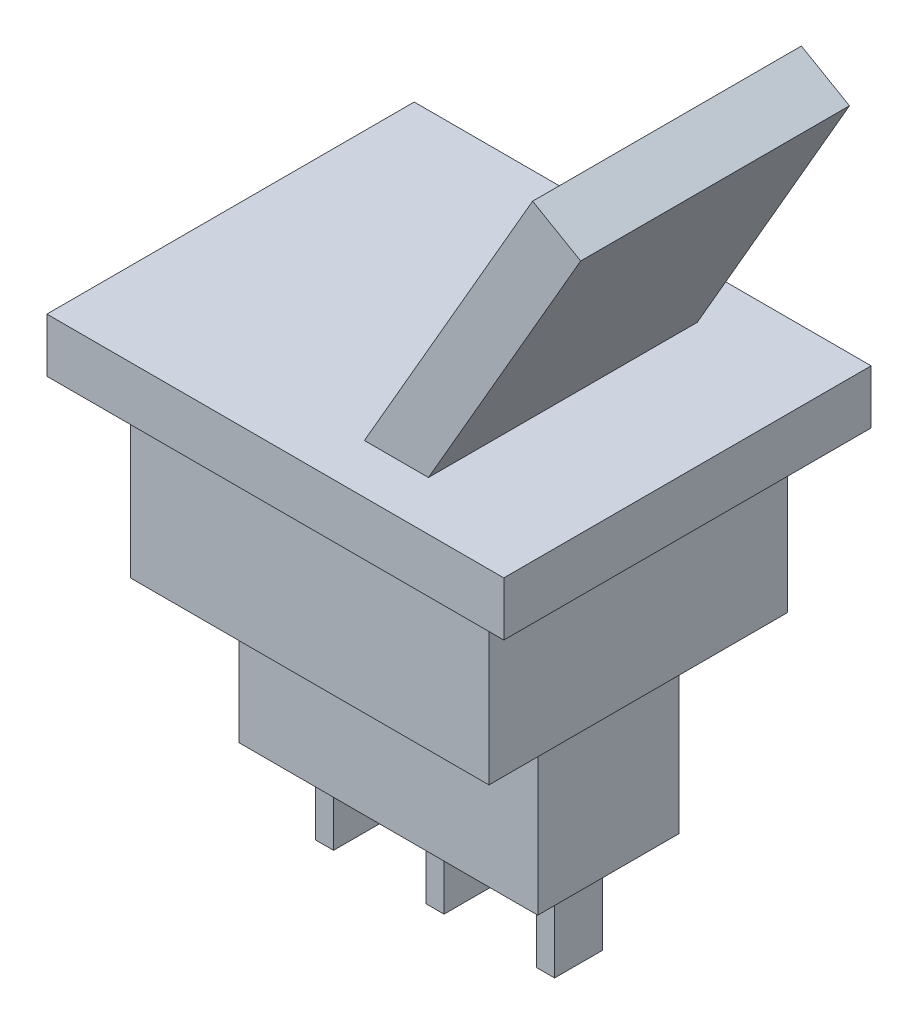
ISO-10303-21;
HEADER;
FILE_DESCRIPTION(('STEP AP214'),'2;1');
FILE_NAME('part.step','',(''),(''),'','','');
FILE_SCHEMA(('AUTOMOTIVE_DESIGN { 1 0 10303 214 1 1 1 1 }'));
ENDSEC;
DATA;
#1=APPLICATION_CONTEXT('core data for automotive mechanical design processes');
#2=APPLICATION_PROTOCOL_DEFINITION('international standard','automotive_design',2000,#1);
#3=PRODUCT_CONTEXT('',#1,'mechanical');
#4=PRODUCT('Part','Part','',(#3));
#5=PRODUCT_RELATED_PRODUCT_CATEGORY('part','',(#4));
#6=PRODUCT_DEFINITION_FORMATION('','',#4);
#7=PRODUCT_DEFINITION_CONTEXT('part definition',#1,'design');
#8=PRODUCT_DEFINITION('design','',#6,#7);
#9=PRODUCT_DEFINITION_SHAPE('','',#8);
#10=(LENGTH_UNIT() NAMED_UNIT(*) SI_UNIT(.MILLI.,.METRE.));
#11=(NAMED_UNIT(*) PLANE_ANGLE_UNIT() SI_UNIT($,.RADIAN.));
#12=(NAMED_UNIT(*) SI_UNIT($,.STERADIAN.) SOLID_ANGLE_UNIT());
#13=UNCERTAINTY_MEASURE_WITH_UNIT(LENGTH_MEASURE(1.E-05),#10,'distance_accuracy_value','');
#14=(GEOMETRIC_REPRESENTATION_CONTEXT(3) GLOBAL_UNCERTAINTY_ASSIGNED_CONTEXT((#13)) GLOBAL_UNIT_ASSIGNED_CONTEXT((#10,
#11,#12)) REPRESENTATION_CONTEXT('',''));
#15=CARTESIAN_POINT('',(0.,0.,0.));
#16=DIRECTION('',(0.,0.,1.));
#17=DIRECTION('',(1.,0.,0.));
#18=AXIS2_PLACEMENT_3D('',#15,#16,#17);
#19=CARTESIAN_POINT('',(0.,-14.22,0.));
#20=DIRECTION('',(0.,-1.,0.));
#21=DIRECTION('',(0.,0.,-1.));
#22=AXIS2_PLACEMENT_3D('',#19,#20,#21);
#23=PLANE('',#22);
#24=DIRECTION('',(0.,0.,1.));
#25=VECTOR('',#24,1.);
#26=CARTESIAN_POINT('',(6.35,-14.22,3.));
#27=LINE('',#26,#25);
#28=CARTESIAN_POINT('',(6.35,-14.22,-3.));
#29=VERTEX_POINT('',#28);
#30=CARTESIAN_POINT('',(6.35,-14.22,3.));
#31=VERTEX_POINT('',#30);
#32=EDGE_CURVE('E334',#29,#31,#27,.T.);
#33=ORIENTED_EDGE('',*,*,#32,.T.);
#34=DIRECTION('',(-1.,0.,0.));
#35=VECTOR('',#34,1.);
#36=CARTESIAN_POINT('',(-6.35,-14.22,3.));
#37=LINE('',#36,#35);
#38=CARTESIAN_POINT('',(-6.35,-14.22,3.));
#39=VERTEX_POINT('',#38);
#40=EDGE_CURVE('E337',#31,#39,#37,.T.);
#41=ORIENTED_EDGE('',*,*,#40,.T.);
#42=DIRECTION('',(0.,0.,-1.));
#43=VECTOR('',#42,1.);
#44=CARTESIAN_POINT('',(-6.35,-14.22,3.));
#45=LINE('',#44,#43);
#46=CARTESIAN_POINT('',(-6.35,-14.22,-3.));
#47=VERTEX_POINT('',#46);
#48=EDGE_CURVE('E340',#39,#47,#45,.T.);
#49=ORIENTED_EDGE('',*,*,#48,.T.);
#50=DIRECTION('',(1.,0.,0.));
#51=VECTOR('',#50,1.);
#52=CARTESIAN_POINT('',(-6.35,-14.22,-3.));
#53=LINE('',#52,#51);
#54=EDGE_CURVE('E342',#47,#29,#53,.T.);
#55=ORIENTED_EDGE('',*,*,#54,.T.);
#56=EDGE_LOOP('',(#33,#41,#49,#55));
#57=FACE_BOUND('',#56,.T.);
#58=DIRECTION('',(-1.,0.,0.));
#59=VECTOR('',#58,1.);
#60=CARTESIAN_POINT('',(-5.08,-14.22,1.015));
#61=LINE('',#60,#59);
#62=CARTESIAN_POINT('',(-4.32,-14.22,1.015));
#63=VERTEX_POINT('',#62);
#64=CARTESIAN_POINT('',(-5.08,-14.22,1.015));
#65=VERTEX_POINT('',#64);
#66=EDGE_CURVE('E318',#63,#65,#61,.T.);
#67=ORIENTED_EDGE('',*,*,#66,.F.);
#68=DIRECTION('',(0.,0.,1.));
#69=VECTOR('',#68,1.);
#70=CARTESIAN_POINT('',(-4.32,-14.22,1.015));
#71=LINE('',#70,#69);
#72=CARTESIAN_POINT('',(-4.32,-14.22,-1.015));
#73=VERTEX_POINT('',#72);
#74=EDGE_CURVE('E304',#73,#63,#71,.T.);
#75=ORIENTED_EDGE('',*,*,#74,.F.);
#76=DIRECTION('',(1.,0.,0.));
#77=VECTOR('',#76,1.);
#78=CARTESIAN_POINT('',(-5.08,-14.22,-1.015));
#79=LINE('',#78,#77);
#80=CARTESIAN_POINT('',(-5.08,-14.22,-1.015));
#81=VERTEX_POINT('',#80);
#82=EDGE_CURVE('E309',#81,#73,#79,.T.);
#83=ORIENTED_EDGE('',*,*,#82,.F.);
#84=DIRECTION('',(0.,0.,-1.));
#85=VECTOR('',#84,1.);
#86=CARTESIAN_POINT('',(-5.08,-14.22,1.015));
#87=LINE('',#86,#85);
#88=EDGE_CURVE('E320',#65,#81,#87,.T.);
#89=ORIENTED_EDGE('',*,*,#88,.F.);
#90=EDGE_LOOP('',(#67,#75,#83,#89));
#91=FACE_BOUND('',#90,.T.);
#92=DIRECTION('',(0.,0.,1.));
#93=VECTOR('',#92,1.);
#94=CARTESIAN_POINT('',(0.38,-14.22,1.015));
#95=LINE('',#94,#93);
#96=CARTESIAN_POINT('',(0.38,-14.22,-1.015));
#97=VERTEX_POINT('',#96);
#98=CARTESIAN_POINT('',(0.38,-14.22,1.015));
#99=VERTEX_POINT('',#98);
#100=EDGE_CURVE('E289',#97,#99,#95,.T.);
#101=ORIENTED_EDGE('',*,*,#100,.F.);
#102=DIRECTION('',(1.,0.,0.));
#103=VECTOR('',#102,1.);
#104=CARTESIAN_POINT('',(-0.38,-14.22,-1.015));
#105=LINE('',#104,#103);
#106=CARTESIAN_POINT('',(-0.38,-14.22,-1.015));
#107=VERTEX_POINT('',#106);
#108=EDGE_CURVE('E275',#107,#97,#105,.T.);
#109=ORIENTED_EDGE('',*,*,#108,.F.);
#110=DIRECTION('',(0.,0.,-1.));
#111=VECTOR('',#110,1.);
#112=CARTESIAN_POINT('',(-0.38,-14.22,1.015));
#113=LINE('',#112,#111);
#114=CARTESIAN_POINT('',(-0.38,-14.22,1.015));
#115=VERTEX_POINT('',#114);
#116=EDGE_CURVE('E280',#115,#107,#113,.T.);
#117=ORIENTED_EDGE('',*,*,#116,.F.);
#118=DIRECTION('',(-1.,0.,0.));
#119=VECTOR('',#118,1.);
#120=CARTESIAN_POINT('',(-0.38,-14.22,1.015));
#121=LINE('',#120,#119);
#122=EDGE_CURVE('E291',#99,#115,#121,.T.);
#123=ORIENTED_EDGE('',*,*,#122,.F.);
#124=EDGE_LOOP('',(#101,#109,#117,#123));
#125=FACE_BOUND('',#124,.T.);
#126=DIRECTION('',(0.,0.,1.));
#127=VECTOR('',#126,1.);
#128=CARTESIAN_POINT('',(5.08,-14.22,1.015));
#129=LINE('',#128,#127);
#130=CARTESIAN_POINT('',(5.08,-14.22,-1.015));
#131=VERTEX_POINT('',#130);
#132=CARTESIAN_POINT('',(5.08,-14.22,1.015));
#133=VERTEX_POINT('',#132);
#134=EDGE_CURVE('E260',#131,#133,#129,.T.);
#135=ORIENTED_EDGE('',*,*,#134,.F.);
#136=DIRECTION('',(1.,0.,0.));
#137=VECTOR('',#136,1.);
#138=CARTESIAN_POINT('',(4.32,-14.22,-1.015));
#139=LINE('',#138,#137);
#140=CARTESIAN_POINT('',(4.32,-14.22,-1.015));
#141=VERTEX_POINT('',#140);
#142=EDGE_CURVE('E245',#141,#131,#139,.T.);
#143=ORIENTED_EDGE('',*,*,#142,.F.);
#144=DIRECTION('',(0.,0.,-1.));
#145=VECTOR('',#144,1.);
#146=CARTESIAN_POINT('',(4.32,-14.22,1.015));
#147=LINE('',#146,#145);
#148=CARTESIAN_POINT('',(4.32,-14.22,1.015));
#149=VERTEX_POINT('',#148);
#150=EDGE_CURVE('E251',#149,#141,#147,.T.);
#151=ORIENTED_EDGE('',*,*,#150,.F.);
#152=DIRECTION('',(-1.,0.,0.));
#153=VECTOR('',#152,1.);
#154=CARTESIAN_POINT('',(4.32,-14.22,1.015));
#155=LINE('',#154,#153);
#156=EDGE_CURVE('E262',#133,#149,#155,.T.);
#157=ORIENTED_EDGE('',*,*,#156,.F.);
#158=EDGE_LOOP('',(#135,#143,#151,#157));
#159=FACE_BOUND('',#158,.T.);
#160=ADVANCED_FACE('F33',(#57,#91,#125,#159),#23,.T.);
#161=CARTESIAN_POINT('',(0.,-7.11,0.));
#162=DIRECTION('',(0.,1.,0.));
#163=DIRECTION('',(0.,0.,1.));
#164=AXIS2_PLACEMENT_3D('',#161,#162,#163);
#165=PLANE('',#164);
#166=DIRECTION('',(0.,0.,1.));
#167=VECTOR('',#166,1.);
#168=CARTESIAN_POINT('',(7.625,-7.11,-6.35));
#169=LINE('',#168,#167);
#170=CARTESIAN_POINT('',(7.625,-7.11,-6.35));
#171=VERTEX_POINT('',#170);
#172=CARTESIAN_POINT('',(7.625,-7.11,6.35));
#173=VERTEX_POINT('',#172);
#174=EDGE_CURVE('E367',#171,#173,#169,.T.);
#175=ORIENTED_EDGE('',*,*,#174,.T.);
#176=DIRECTION('',(-1.,0.,0.));
#177=VECTOR('',#176,1.);
#178=CARTESIAN_POINT('',(-7.625,-7.11,6.35));
#179=LINE('',#178,#177);
#180=CARTESIAN_POINT('',(-7.625,-7.11,6.35));
#181=VERTEX_POINT('',#180);
#182=EDGE_CURVE('E370',#173,#181,#179,.T.);
#183=ORIENTED_EDGE('',*,*,#182,.T.);
#184=DIRECTION('',(0.,0.,-1.));
#185=VECTOR('',#184,1.);
#186=CARTESIAN_POINT('',(-7.625,-7.11,-6.35));
#187=LINE('',#186,#185);
#188=CARTESIAN_POINT('',(-7.625,-7.11,-6.35));
#189=VERTEX_POINT('',#188);
#190=EDGE_CURVE('E373',#181,#189,#187,.T.);
#191=ORIENTED_EDGE('',*,*,#190,.T.);
#192=DIRECTION('',(1.,0.,0.));
#193=VECTOR('',#192,1.);
#194=CARTESIAN_POINT('',(-7.625,-7.11,-6.35));
#195=LINE('',#194,#193);
#196=EDGE_CURVE('E375',#189,#171,#195,.T.);
#197=ORIENTED_EDGE('',*,*,#196,.T.);
#198=EDGE_LOOP('',(#175,#183,#191,#197));
#199=FACE_BOUND('',#198,.T.);
#200=DIRECTION('',(0.,0.,1.));
#201=VECTOR('',#200,1.);
#202=CARTESIAN_POINT('',(6.35,-7.11,3.));
#203=LINE('',#202,#201);
#204=CARTESIAN_POINT('',(6.35,-7.11,-3.));
#205=VERTEX_POINT('',#204);
#206=CARTESIAN_POINT('',(6.35,-7.11,3.));
#207=VERTEX_POINT('',#206);
#208=EDGE_CURVE('E333',#205,#207,#203,.T.);
#209=ORIENTED_EDGE('',*,*,#208,.F.);
#210=DIRECTION('',(1.,0.,0.));
#211=VECTOR('',#210,1.);
#212=CARTESIAN_POINT('',(-6.35,-7.11,-3.));
#213=LINE('',#212,#211);
#214=CARTESIAN_POINT('',(-6.35,-7.11,-3.));
#215=VERTEX_POINT('',#214);
#216=EDGE_CURVE('E338',#215,#205,#213,.T.);
#217=ORIENTED_EDGE('',*,*,#216,.F.);
#218=DIRECTION('',(0.,0.,-1.));
#219=VECTOR('',#218,1.);
#220=CARTESIAN_POINT('',(-6.35,-7.11,3.));
#221=LINE('',#220,#219);
#222=CARTESIAN_POINT('',(-6.35,-7.11,3.));
#223=VERTEX_POINT('',#222);
#224=EDGE_CURVE('E350',#223,#215,#221,.T.);
#225=ORIENTED_EDGE('',*,*,#224,.F.);
#226=DIRECTION('',(-1.,0.,0.));
#227=VECTOR('',#226,1.);
#228=CARTESIAN_POINT('',(-6.35,-7.11,3.));
#229=LINE('',#228,#227);
#230=EDGE_CURVE('E347',#207,#223,#229,.T.);
#231=ORIENTED_EDGE('',*,*,#230,.F.);
#232=EDGE_LOOP('',(#209,#217,#225,#231));
#233=FACE_BOUND('',#232,.T.);
#234=ADVANCED_FACE('F450',(#199,#233),#165,.F.);
#235=CARTESIAN_POINT('',(9.715,2.29,7.81));
#236=DIRECTION('',(-1.,0.,0.));
#237=DIRECTION('',(0.,0.,1.));
#238=AXIS2_PLACEMENT_3D('',#235,#236,#237);
#239=PLANE('',#238);
#240=DIRECTION('',(0.,0.,-1.));
#241=VECTOR('',#240,1.);
#242=CARTESIAN_POINT('',(9.715,0.,7.81));
#243=LINE('',#242,#241);
#244=CARTESIAN_POINT('',(9.715,0.,7.81));
#245=VERTEX_POINT('',#244);
#246=CARTESIAN_POINT('',(9.715,0.,-7.81));
#247=VERTEX_POINT('',#246);
#248=EDGE_CURVE('E399',#245,#247,#243,.T.);
#249=ORIENTED_EDGE('',*,*,#248,.T.);
#250=DIRECTION('',(0.,-1.,0.));
#251=VECTOR('',#250,1.);
#252=CARTESIAN_POINT('',(9.715,2.29,-7.81));
#253=LINE('',#252,#251);
#254=CARTESIAN_POINT('',(9.715,2.29,-7.81));
#255=VERTEX_POINT('',#254);
#256=EDGE_CURVE('E426',#255,#247,#253,.T.);
#257=ORIENTED_EDGE('',*,*,#256,.F.);
#258=DIRECTION('',(0.,0.,-1.));
#259=VECTOR('',#258,1.);
#260=CARTESIAN_POINT('',(9.715,2.29,7.81));
#261=LINE('',#260,#259);
#262=CARTESIAN_POINT('',(9.715,2.29,7.81));
#263=VERTEX_POINT('',#262);
#264=EDGE_CURVE('E400',#263,#255,#261,.T.);
#265=ORIENTED_EDGE('',*,*,#264,.F.);
#266=DIRECTION('',(0.,-1.,0.));
#267=VECTOR('',#266,1.);
#268=CARTESIAN_POINT('',(9.715,2.29,7.81));
#269=LINE('',#268,#267);
#270=EDGE_CURVE('E410',#263,#245,#269,.T.);
#271=ORIENTED_EDGE('',*,*,#270,.T.);
#272=EDGE_LOOP('',(#249,#257,#265,#271));
#273=FACE_BOUND('',#272,.T.);
#274=ADVANCED_FACE('F35',(#273),#239,.F.);
#275=CARTESIAN_POINT('',(-9.715,2.29,-7.81));
#276=DIRECTION('',(0.,0.,1.));
#277=DIRECTION('',(1.,0.,0.));
#278=AXIS2_PLACEMENT_3D('',#275,#276,#277);
#279=PLANE('',#278);
#280=DIRECTION('',(-1.,0.,0.));
#281=VECTOR('',#280,1.);
#282=CARTESIAN_POINT('',(-9.715,0.,-7.81));
#283=LINE('',#282,#281);
#284=CARTESIAN_POINT('',(-9.715,0.,-7.81));
#285=VERTEX_POINT('',#284);
#286=EDGE_CURVE('E413',#247,#285,#283,.T.);
#287=ORIENTED_EDGE('',*,*,#286,.T.);
#288=DIRECTION('',(0.,-1.,0.));
#289=VECTOR('',#288,1.);
#290=CARTESIAN_POINT('',(-9.715,2.29,-7.81));
#291=LINE('',#290,#289);
#292=CARTESIAN_POINT('',(-9.715,2.29,-7.81));
#293=VERTEX_POINT('',#292);
#294=EDGE_CURVE('E423',#293,#285,#291,.T.);
#295=ORIENTED_EDGE('',*,*,#294,.F.);
#296=DIRECTION('',(-1.,0.,0.));
#297=VECTOR('',#296,1.);
#298=CARTESIAN_POINT('',(-9.715,2.29,-7.81));
#299=LINE('',#298,#297);
#300=EDGE_CURVE('E403',#255,#293,#299,.T.);
#301=ORIENTED_EDGE('',*,*,#300,.F.);
#302=ORIENTED_EDGE('',*,*,#256,.T.);
#303=EDGE_LOOP('',(#287,#295,#301,#302));
#304=FACE_BOUND('',#303,.T.);
#305=ADVANCED_FACE('F507',(#304),#279,.F.);
#306=CARTESIAN_POINT('',(-9.715,2.29,7.81));
#307=DIRECTION('',(1.,0.,0.));
#308=DIRECTION('',(0.,0.,-1.));
#309=AXIS2_PLACEMENT_3D('',#306,#307,#308);
#310=PLANE('',#309);
#311=DIRECTION('',(0.,0.,1.));
#312=VECTOR('',#311,1.);
#313=CARTESIAN_POINT('',(-9.715,0.,7.81));
#314=LINE('',#313,#312);
#315=CARTESIAN_POINT('',(-9.715,0.,7.81));
#316=VERTEX_POINT('',#315);
#317=EDGE_CURVE('E415',#285,#316,#314,.T.);
#318=ORIENTED_EDGE('',*,*,#317,.T.);
#319=DIRECTION('',(0.,-1.,0.));
#320=VECTOR('',#319,1.);
#321=CARTESIAN_POINT('',(-9.715,2.29,7.81));
#322=LINE('',#321,#320);
#323=CARTESIAN_POINT('',(-9.715,2.29,7.81));
#324=VERTEX_POINT('',#323);
#325=EDGE_CURVE('E420',#324,#316,#322,.T.);
#326=ORIENTED_EDGE('',*,*,#325,.F.);
#327=DIRECTION('',(0.,0.,1.));
#328=VECTOR('',#327,1.);
#329=CARTESIAN_POINT('',(-9.715,2.29,7.81));
#330=LINE('',#329,#328);
#331=EDGE_CURVE('E406',#293,#324,#330,.T.);
#332=ORIENTED_EDGE('',*,*,#331,.F.);
#333=ORIENTED_EDGE('',*,*,#294,.T.);
#334=EDGE_LOOP('',(#318,#326,#332,#333));
#335=FACE_BOUND('',#334,.T.);
#336=ADVANCED_FACE('F504',(#335),#310,.F.);
#337=CARTESIAN_POINT('',(-9.715,2.29,7.81));
#338=DIRECTION('',(0.,0.,-1.));
#339=DIRECTION('',(-1.,0.,0.));
#340=AXIS2_PLACEMENT_3D('',#337,#338,#339);
#341=PLANE('',#340);
#342=DIRECTION('',(1.,0.,0.));
#343=VECTOR('',#342,1.);
#344=CARTESIAN_POINT('',(-9.715,0.,7.81));
#345=LINE('',#344,#343);
#346=EDGE_CURVE('E404',#316,#245,#345,.T.);
#347=ORIENTED_EDGE('',*,*,#346,.T.);
#348=ORIENTED_EDGE('',*,*,#270,.F.);
#349=DIRECTION('',(1.,0.,0.));
#350=VECTOR('',#349,1.);
#351=CARTESIAN_POINT('',(-9.715,2.29,7.81));
#352=LINE('',#351,#350);
#353=EDGE_CURVE('E408',#324,#263,#352,.T.);
#354=ORIENTED_EDGE('',*,*,#353,.F.);
#355=ORIENTED_EDGE('',*,*,#325,.T.);
#356=EDGE_LOOP('',(#347,#348,#354,#355));
#357=FACE_BOUND('',#356,.T.);
#358=ADVANCED_FACE('F498',(#357),#341,.F.);
#359=CARTESIAN_POINT('',(0.,2.29,0.));
#360=DIRECTION('',(0.,-1.,0.));
#361=DIRECTION('',(0.,0.,-1.));
#362=AXIS2_PLACEMENT_3D('',#359,#360,#361);
#363=PLANE('',#362);
#364=DIRECTION('',(0.,0.,-1.));
#365=VECTOR('',#364,1.);
#366=CARTESIAN_POINT('',(1.69163628872558,2.29,0.));
#367=LINE('',#366,#365);
#368=CARTESIAN_POINT('',(1.69163628872558,2.29,5.715));
#369=VERTEX_POINT('',#368);
#370=CARTESIAN_POINT('',(1.69163628872558,2.29,-5.715));
#371=VERTEX_POINT('',#370);
#372=EDGE_CURVE('E41',#369,#371,#367,.T.);
#373=ORIENTED_EDGE('',*,*,#372,.T.);
#374=DIRECTION('',(1.,0.,0.));
#375=VECTOR('',#374,1.);
#376=CARTESIAN_POINT('',(0.,2.29,-5.715));
#377=LINE('',#376,#375);
#378=CARTESIAN_POINT('',(4.41672955930062,2.29,-5.715));
#379=VERTEX_POINT('',#378);
#380=EDGE_CURVE('E11',#371,#379,#377,.T.);
#381=ORIENTED_EDGE('',*,*,#380,.T.);
#382=DIRECTION('',(0.,0.,1.));
#383=VECTOR('',#382,1.);
#384=CARTESIAN_POINT('',(4.41672955930062,2.29,0.));
#385=LINE('',#384,#383);
#386=CARTESIAN_POINT('',(4.41672955930062,2.29,5.715));
#387=VERTEX_POINT('',#386);
#388=EDGE_CURVE('E430',#379,#387,#385,.T.);
#389=ORIENTED_EDGE('',*,*,#388,.T.);
#390=DIRECTION('',(1.,0.,0.));
#391=VECTOR('',#390,1.);
#392=CARTESIAN_POINT('',(0.,2.29,5.715));
#393=LINE('',#392,#391);
#394=EDGE_CURVE('E221',#369,#387,#393,.T.);
#395=ORIENTED_EDGE('',*,*,#394,.F.);
#396=EDGE_LOOP('',(#373,#381,#389,#395));
#397=FACE_BOUND('',#396,.T.);
#398=ORIENTED_EDGE('',*,*,#264,.T.);
#399=ORIENTED_EDGE('',*,*,#300,.T.);
#400=ORIENTED_EDGE('',*,*,#331,.T.);
#401=ORIENTED_EDGE('',*,*,#353,.T.);
#402=EDGE_LOOP('',(#398,#399,#400,#401));
#403=FACE_BOUND('',#402,.T.);
#404=ADVANCED_FACE('F431',(#397,#403),#363,.F.);
#405=CARTESIAN_POINT('',(0.,0.,0.));
#406=DIRECTION('',(0.,-1.,0.));
#407=DIRECTION('',(0.,0.,-1.));
#408=AXIS2_PLACEMENT_3D('',#405,#406,#407);
#409=PLANE('',#408);
#410=DIRECTION('',(0.,0.,1.));
#411=VECTOR('',#410,1.);
#412=CARTESIAN_POINT('',(7.625,0.,-6.35));
#413=LINE('',#412,#411);
#414=CARTESIAN_POINT('',(7.625,0.,-6.35));
#415=VERTEX_POINT('',#414);
#416=CARTESIAN_POINT('',(7.625,0.,6.35));
#417=VERTEX_POINT('',#416);
#418=EDGE_CURVE('E366',#415,#417,#413,.T.);
#419=ORIENTED_EDGE('',*,*,#418,.F.);
#420=DIRECTION('',(1.,0.,0.));
#421=VECTOR('',#420,1.);
#422=CARTESIAN_POINT('',(-7.625,0.,-6.35));
#423=LINE('',#422,#421);
#424=CARTESIAN_POINT('',(-7.625,0.,-6.35));
#425=VERTEX_POINT('',#424);
#426=EDGE_CURVE('E371',#425,#415,#423,.T.);
#427=ORIENTED_EDGE('',*,*,#426,.F.);
#428=DIRECTION('',(0.,0.,-1.));
#429=VECTOR('',#428,1.);
#430=CARTESIAN_POINT('',(-7.625,0.,-6.35));
#431=LINE('',#430,#429);
#432=CARTESIAN_POINT('',(-7.625,0.,6.35));
#433=VERTEX_POINT('',#432);
#434=EDGE_CURVE('E383',#433,#425,#431,.T.);
#435=ORIENTED_EDGE('',*,*,#434,.F.);
#436=DIRECTION('',(-1.,0.,0.));
#437=VECTOR('',#436,1.);
#438=CARTESIAN_POINT('',(-7.625,0.,6.35));
#439=LINE('',#438,#437);
#440=EDGE_CURVE('E380',#417,#433,#439,.T.);
#441=ORIENTED_EDGE('',*,*,#440,.F.);
#442=EDGE_LOOP('',(#419,#427,#435,#441));
#443=FACE_BOUND('',#442,.T.);
#444=ORIENTED_EDGE('',*,*,#248,.F.);
#445=ORIENTED_EDGE('',*,*,#346,.F.);
#446=ORIENTED_EDGE('',*,*,#317,.F.);
#447=ORIENTED_EDGE('',*,*,#286,.F.);
#448=EDGE_LOOP('',(#444,#445,#446,#447));
#449=FACE_BOUND('',#448,.T.);
#450=ADVANCED_FACE('F494',(#443,#449),#409,.T.);
#451=CARTESIAN_POINT('',(7.625,-7.11,-6.35));
#452=DIRECTION('',(-1.,0.,0.));
#453=DIRECTION('',(0.,0.,1.));
#454=AXIS2_PLACEMENT_3D('',#451,#452,#453);
#455=PLANE('',#454);
#456=ORIENTED_EDGE('',*,*,#418,.T.);
#457=DIRECTION('',(0.,1.,0.));
#458=VECTOR('',#457,1.);
#459=CARTESIAN_POINT('',(7.625,-7.11,6.35));
#460=LINE('',#459,#458);
#461=EDGE_CURVE('E396',#173,#417,#460,.T.);
#462=ORIENTED_EDGE('',*,*,#461,.F.);
#463=ORIENTED_EDGE('',*,*,#174,.F.);
#464=DIRECTION('',(0.,1.,0.));
#465=VECTOR('',#464,1.);
#466=CARTESIAN_POINT('',(7.625,-7.11,-6.35));
#467=LINE('',#466,#465);
#468=EDGE_CURVE('E377',#171,#415,#467,.T.);
#469=ORIENTED_EDGE('',*,*,#468,.T.);
#470=EDGE_LOOP('',(#456,#462,#463,#469));
#471=FACE_BOUND('',#470,.T.);
#472=ADVANCED_FACE('F490',(#471),#455,.F.);
#473=CARTESIAN_POINT('',(-7.625,-7.11,6.35));
#474=DIRECTION('',(0.,0.,-1.));
#475=DIRECTION('',(-1.,0.,0.));
#476=AXIS2_PLACEMENT_3D('',#473,#474,#475);
#477=PLANE('',#476);
#478=ORIENTED_EDGE('',*,*,#440,.T.);
#479=DIRECTION('',(0.,1.,0.));
#480=VECTOR('',#479,1.);
#481=CARTESIAN_POINT('',(-7.625,-7.11,6.35));
#482=LINE('',#481,#480);
#483=EDGE_CURVE('E393',#181,#433,#482,.T.);
#484=ORIENTED_EDGE('',*,*,#483,.F.);
#485=ORIENTED_EDGE('',*,*,#182,.F.);
#486=ORIENTED_EDGE('',*,*,#461,.T.);
#487=EDGE_LOOP('',(#478,#484,#485,#486));
#488=FACE_BOUND('',#487,.T.);
#489=ADVANCED_FACE('F486',(#488),#477,.F.);
#490=CARTESIAN_POINT('',(-7.625,-7.11,-6.35));
#491=DIRECTION('',(1.,0.,0.));
#492=DIRECTION('',(0.,0.,-1.));
#493=AXIS2_PLACEMENT_3D('',#490,#491,#492);
#494=PLANE('',#493);
#495=ORIENTED_EDGE('',*,*,#434,.T.);
#496=DIRECTION('',(0.,1.,0.));
#497=VECTOR('',#496,1.);
#498=CARTESIAN_POINT('',(-7.625,-7.11,-6.35));
#499=LINE('',#498,#497);
#500=EDGE_CURVE('E390',#189,#425,#499,.T.);
#501=ORIENTED_EDGE('',*,*,#500,.F.);
#502=ORIENTED_EDGE('',*,*,#190,.F.);
#503=ORIENTED_EDGE('',*,*,#483,.T.);
#504=EDGE_LOOP('',(#495,#501,#502,#503));
#505=FACE_BOUND('',#504,.T.);
#506=ADVANCED_FACE('F482',(#505),#494,.F.);
#507=CARTESIAN_POINT('',(-7.625,-7.11,-6.35));
#508=DIRECTION('',(0.,0.,1.));
#509=DIRECTION('',(1.,0.,0.));
#510=AXIS2_PLACEMENT_3D('',#507,#508,#509);
#511=PLANE('',#510);
#512=ORIENTED_EDGE('',*,*,#426,.T.);
#513=ORIENTED_EDGE('',*,*,#468,.F.);
#514=ORIENTED_EDGE('',*,*,#196,.F.);
#515=ORIENTED_EDGE('',*,*,#500,.T.);
#516=EDGE_LOOP('',(#512,#513,#514,#515));
#517=FACE_BOUND('',#516,.T.);
#518=ADVANCED_FACE('F477',(#517),#511,.F.);
#519=CARTESIAN_POINT('',(6.35,-14.22,3.));
#520=DIRECTION('',(-1.,0.,0.));
#521=DIRECTION('',(0.,0.,1.));
#522=AXIS2_PLACEMENT_3D('',#519,#520,#521);
#523=PLANE('',#522);
#524=ORIENTED_EDGE('',*,*,#208,.T.);
#525=DIRECTION('',(0.,1.,0.));
#526=VECTOR('',#525,1.);
#527=CARTESIAN_POINT('',(6.35,-14.22,3.));
#528=LINE('',#527,#526);
#529=EDGE_CURVE('E363',#31,#207,#528,.T.);
#530=ORIENTED_EDGE('',*,*,#529,.F.);
#531=ORIENTED_EDGE('',*,*,#32,.F.);
#532=DIRECTION('',(0.,1.,0.));
#533=VECTOR('',#532,1.);
#534=CARTESIAN_POINT('',(6.35,-14.22,-3.));
#535=LINE('',#534,#533);
#536=EDGE_CURVE('E344',#29,#205,#535,.T.);
#537=ORIENTED_EDGE('',*,*,#536,.T.);
#538=EDGE_LOOP('',(#524,#530,#531,#537));
#539=FACE_BOUND('',#538,.T.);
#540=ADVANCED_FACE('F474',(#539),#523,.F.);
#541=CARTESIAN_POINT('',(-6.35,-14.22,3.));
#542=DIRECTION('',(0.,0.,-1.));
#543=DIRECTION('',(-1.,0.,0.));
#544=AXIS2_PLACEMENT_3D('',#541,#542,#543);
#545=PLANE('',#544);
#546=ORIENTED_EDGE('',*,*,#230,.T.);
#547=DIRECTION('',(0.,1.,0.));
#548=VECTOR('',#547,1.);
#549=CARTESIAN_POINT('',(-6.35,-14.22,3.));
#550=LINE('',#549,#548);
#551=EDGE_CURVE('E360',#39,#223,#550,.T.);
#552=ORIENTED_EDGE('',*,*,#551,.F.);
#553=ORIENTED_EDGE('',*,*,#40,.F.);
#554=ORIENTED_EDGE('',*,*,#529,.T.);
#555=EDGE_LOOP('',(#546,#552,#553,#554));
#556=FACE_BOUND('',#555,.T.);
#557=ADVANCED_FACE('F470',(#556),#545,.F.);
#558=CARTESIAN_POINT('',(-6.35,-14.22,3.));
#559=DIRECTION('',(1.,0.,0.));
#560=DIRECTION('',(0.,0.,-1.));
#561=AXIS2_PLACEMENT_3D('',#558,#559,#560);
#562=PLANE('',#561);
#563=ORIENTED_EDGE('',*,*,#224,.T.);
#564=DIRECTION('',(0.,1.,0.));
#565=VECTOR('',#564,1.);
#566=CARTESIAN_POINT('',(-6.35,-14.22,-3.));
#567=LINE('',#566,#565);
#568=EDGE_CURVE('E357',#47,#215,#567,.T.);
#569=ORIENTED_EDGE('',*,*,#568,.F.);
#570=ORIENTED_EDGE('',*,*,#48,.F.);
#571=ORIENTED_EDGE('',*,*,#551,.T.);
#572=EDGE_LOOP('',(#563,#569,#570,#571));
#573=FACE_BOUND('',#572,.T.);
#574=ADVANCED_FACE('F466',(#573),#562,.F.);
#575=CARTESIAN_POINT('',(-6.35,-14.22,-3.));
#576=DIRECTION('',(0.,0.,1.));
#577=DIRECTION('',(1.,0.,0.));
#578=AXIS2_PLACEMENT_3D('',#575,#576,#577);
#579=PLANE('',#578);
#580=ORIENTED_EDGE('',*,*,#216,.T.);
#581=ORIENTED_EDGE('',*,*,#536,.F.);
#582=ORIENTED_EDGE('',*,*,#54,.F.);
#583=ORIENTED_EDGE('',*,*,#568,.T.);
#584=EDGE_LOOP('',(#580,#581,#582,#583));
#585=FACE_BOUND('',#584,.T.);
#586=ADVANCED_FACE('F463',(#585),#579,.F.);
#587=CARTESIAN_POINT('',(-4.32,-18.16,1.015));
#588=DIRECTION('',(-1.,0.,0.));
#589=DIRECTION('',(0.,0.,1.));
#590=AXIS2_PLACEMENT_3D('',#587,#588,#589);
#591=PLANE('',#590);
#592=ORIENTED_EDGE('',*,*,#74,.T.);
#593=DIRECTION('',(0.,1.,0.));
#594=VECTOR('',#593,1.);
#595=CARTESIAN_POINT('',(-4.32,-18.16,1.015));
#596=LINE('',#595,#594);
#597=CARTESIAN_POINT('',(-4.32,-18.16,1.015));
#598=VERTEX_POINT('',#597);
#599=EDGE_CURVE('E331',#598,#63,#596,.T.);
#600=ORIENTED_EDGE('',*,*,#599,.F.);
#601=DIRECTION('',(0.,0.,1.));
#602=VECTOR('',#601,1.);
#603=CARTESIAN_POINT('',(-4.32,-18.16,1.015));
#604=LINE('',#603,#602);
#605=CARTESIAN_POINT('',(-4.32,-18.16,-1.015));
#606=VERTEX_POINT('',#605);
#607=EDGE_CURVE('E305',#606,#598,#604,.T.);
#608=ORIENTED_EDGE('',*,*,#607,.F.);
#609=DIRECTION('',(0.,1.,0.));
#610=VECTOR('',#609,1.);
#611=CARTESIAN_POINT('',(-4.32,-18.16,-1.015));
#612=LINE('',#611,#610);
#613=EDGE_CURVE('E315',#606,#73,#612,.T.);
#614=ORIENTED_EDGE('',*,*,#613,.T.);
#615=EDGE_LOOP('',(#592,#600,#608,#614));
#616=FACE_BOUND('',#615,.T.);
#617=ADVANCED_FACE('F461',(#616),#591,.F.);
#618=CARTESIAN_POINT('',(-5.08,-18.16,1.015));
#619=DIRECTION('',(0.,0.,-1.));
#620=DIRECTION('',(-1.,0.,0.));
#621=AXIS2_PLACEMENT_3D('',#618,#619,#620);
#622=PLANE('',#621);
#623=ORIENTED_EDGE('',*,*,#66,.T.);
#624=DIRECTION('',(0.,1.,0.));
#625=VECTOR('',#624,1.);
#626=CARTESIAN_POINT('',(-5.08,-18.16,1.015));
#627=LINE('',#626,#625);
#628=CARTESIAN_POINT('',(-5.08,-18.16,1.015));
#629=VERTEX_POINT('',#628);
#630=EDGE_CURVE('E328',#629,#65,#627,.T.);
#631=ORIENTED_EDGE('',*,*,#630,.F.);
#632=DIRECTION('',(-1.,0.,0.));
#633=VECTOR('',#632,1.);
#634=CARTESIAN_POINT('',(-5.08,-18.16,1.015));
#635=LINE('',#634,#633);
#636=EDGE_CURVE('E308',#598,#629,#635,.T.);
#637=ORIENTED_EDGE('',*,*,#636,.F.);
#638=ORIENTED_EDGE('',*,*,#599,.T.);
#639=EDGE_LOOP('',(#623,#631,#637,#638));
#640=FACE_BOUND('',#639,.T.);
#641=ADVANCED_FACE('F573',(#640),#622,.F.);
#642=CARTESIAN_POINT('',(-5.08,-18.16,1.015));
#643=DIRECTION('',(1.,0.,0.));
#644=DIRECTION('',(0.,0.,-1.));
#645=AXIS2_PLACEMENT_3D('',#642,#643,#644);
#646=PLANE('',#645);
#647=ORIENTED_EDGE('',*,*,#88,.T.);
#648=DIRECTION('',(0.,1.,0.));
#649=VECTOR('',#648,1.);
#650=CARTESIAN_POINT('',(-5.08,-18.16,-1.015));
#651=LINE('',#650,#649);
#652=CARTESIAN_POINT('',(-5.08,-18.16,-1.015));
#653=VERTEX_POINT('',#652);
#654=EDGE_CURVE('E326',#653,#81,#651,.T.);
#655=ORIENTED_EDGE('',*,*,#654,.F.);
#656=DIRECTION('',(0.,0.,-1.));
#657=VECTOR('',#656,1.);
#658=CARTESIAN_POINT('',(-5.08,-18.16,1.015));
#659=LINE('',#658,#657);
#660=EDGE_CURVE('E311',#629,#653,#659,.T.);
#661=ORIENTED_EDGE('',*,*,#660,.F.);
#662=ORIENTED_EDGE('',*,*,#630,.T.);
#663=EDGE_LOOP('',(#647,#655,#661,#662));
#664=FACE_BOUND('',#663,.T.);
#665=ADVANCED_FACE('F582',(#664),#646,.F.);
#666=CARTESIAN_POINT('',(-5.08,-18.16,-1.015));
#667=DIRECTION('',(0.,0.,1.));
#668=DIRECTION('',(1.,0.,0.));
#669=AXIS2_PLACEMENT_3D('',#666,#667,#668);
#670=PLANE('',#669);
#671=ORIENTED_EDGE('',*,*,#82,.T.);
#672=ORIENTED_EDGE('',*,*,#613,.F.);
#673=DIRECTION('',(1.,0.,0.));
#674=VECTOR('',#673,1.);
#675=CARTESIAN_POINT('',(-5.08,-18.16,-1.015));
#676=LINE('',#675,#674);
#677=EDGE_CURVE('E313',#653,#606,#676,.T.);
#678=ORIENTED_EDGE('',*,*,#677,.F.);
#679=ORIENTED_EDGE('',*,*,#654,.T.);
#680=EDGE_LOOP('',(#671,#672,#678,#679));
#681=FACE_BOUND('',#680,.T.);
#682=ADVANCED_FACE('F591',(#681),#670,.F.);
#683=CARTESIAN_POINT('',(0.,-18.16,0.));
#684=DIRECTION('',(0.,-1.,0.));
#685=DIRECTION('',(0.,0.,-1.));
#686=AXIS2_PLACEMENT_3D('',#683,#684,#685);
#687=PLANE('',#686);
#688=ORIENTED_EDGE('',*,*,#607,.T.);
#689=ORIENTED_EDGE('',*,*,#636,.T.);
#690=ORIENTED_EDGE('',*,*,#660,.T.);
#691=ORIENTED_EDGE('',*,*,#677,.T.);
#692=EDGE_LOOP('',(#688,#689,#690,#691));
#693=FACE_BOUND('',#692,.T.);
#694=ADVANCED_FACE('F601',(#693),#687,.T.);
#695=CARTESIAN_POINT('',(-0.38,-18.16,-1.015));
#696=DIRECTION('',(0.,0.,1.));
#697=DIRECTION('',(1.,0.,0.));
#698=AXIS2_PLACEMENT_3D('',#695,#696,#697);
#699=PLANE('',#698);
#700=ORIENTED_EDGE('',*,*,#108,.T.);
#701=DIRECTION('',(0.,1.,0.));
#702=VECTOR('',#701,1.);
#703=CARTESIAN_POINT('',(0.38,-18.16,-1.015));
#704=LINE('',#703,#702);
#705=CARTESIAN_POINT('',(0.38,-18.16,-1.015));
#706=VERTEX_POINT('',#705);
#707=EDGE_CURVE('E302',#706,#97,#704,.T.);
#708=ORIENTED_EDGE('',*,*,#707,.F.);
#709=DIRECTION('',(1.,0.,0.));
#710=VECTOR('',#709,1.);
#711=CARTESIAN_POINT('',(-0.38,-18.16,-1.015));
#712=LINE('',#711,#710);
#713=CARTESIAN_POINT('',(-0.38,-18.16,-1.015));
#714=VERTEX_POINT('',#713);
#715=EDGE_CURVE('E276',#714,#706,#712,.T.);
#716=ORIENTED_EDGE('',*,*,#715,.F.);
#717=DIRECTION('',(0.,1.,0.));
#718=VECTOR('',#717,1.);
#719=CARTESIAN_POINT('',(-0.38,-18.16,-1.015));
#720=LINE('',#719,#718);
#721=EDGE_CURVE('E286',#714,#107,#720,.T.);
#722=ORIENTED_EDGE('',*,*,#721,.T.);
#723=EDGE_LOOP('',(#700,#708,#716,#722));
#724=FACE_BOUND('',#723,.T.);
#725=ADVANCED_FACE('F611',(#724),#699,.F.);
#726=CARTESIAN_POINT('',(0.38,-18.16,1.015));
#727=DIRECTION('',(-1.,0.,0.));
#728=DIRECTION('',(0.,0.,1.));
#729=AXIS2_PLACEMENT_3D('',#726,#727,#728);
#730=PLANE('',#729);
#731=ORIENTED_EDGE('',*,*,#100,.T.);
#732=DIRECTION('',(0.,1.,0.));
#733=VECTOR('',#732,1.);
#734=CARTESIAN_POINT('',(0.38,-18.16,1.015));
#735=LINE('',#734,#733);
#736=CARTESIAN_POINT('',(0.38,-18.16,1.015));
#737=VERTEX_POINT('',#736);
#738=EDGE_CURVE('E299',#737,#99,#735,.T.);
#739=ORIENTED_EDGE('',*,*,#738,.F.);
#740=DIRECTION('',(0.,0.,1.));
#741=VECTOR('',#740,1.);
#742=CARTESIAN_POINT('',(0.38,-18.16,1.015));
#743=LINE('',#742,#741);
#744=EDGE_CURVE('E279',#706,#737,#743,.T.);
#745=ORIENTED_EDGE('',*,*,#744,.F.);
#746=ORIENTED_EDGE('',*,*,#707,.T.);
#747=EDGE_LOOP('',(#731,#739,#745,#746));
#748=FACE_BOUND('',#747,.T.);
#749=ADVANCED_FACE('F621',(#748),#730,.F.);
#750=CARTESIAN_POINT('',(-0.38,-18.16,1.015));
#751=DIRECTION('',(0.,0.,-1.));
#752=DIRECTION('',(-1.,0.,0.));
#753=AXIS2_PLACEMENT_3D('',#750,#751,#752);
#754=PLANE('',#753);
#755=ORIENTED_EDGE('',*,*,#122,.T.);
#756=DIRECTION('',(0.,1.,0.));
#757=VECTOR('',#756,1.);
#758=CARTESIAN_POINT('',(-0.38,-18.16,1.015));
#759=LINE('',#758,#757);
#760=CARTESIAN_POINT('',(-0.38,-18.16,1.015));
#761=VERTEX_POINT('',#760);
#762=EDGE_CURVE('E297',#761,#115,#759,.T.);
#763=ORIENTED_EDGE('',*,*,#762,.F.);
#764=DIRECTION('',(-1.,0.,0.));
#765=VECTOR('',#764,1.);
#766=CARTESIAN_POINT('',(-0.38,-18.16,1.015));
#767=LINE('',#766,#765);
#768=EDGE_CURVE('E282',#737,#761,#767,.T.);
#769=ORIENTED_EDGE('',*,*,#768,.F.);
#770=ORIENTED_EDGE('',*,*,#738,.T.);
#771=EDGE_LOOP('',(#755,#763,#769,#770));
#772=FACE_BOUND('',#771,.T.);
#773=ADVANCED_FACE('F631',(#772),#754,.F.);
#774=CARTESIAN_POINT('',(-0.38,-18.16,1.015));
#775=DIRECTION('',(1.,0.,0.));
#776=DIRECTION('',(0.,0.,-1.));
#777=AXIS2_PLACEMENT_3D('',#774,#775,#776);
#778=PLANE('',#777);
#779=ORIENTED_EDGE('',*,*,#116,.T.);
#780=ORIENTED_EDGE('',*,*,#721,.F.);
#781=DIRECTION('',(0.,0.,-1.));
#782=VECTOR('',#781,1.);
#783=CARTESIAN_POINT('',(-0.38,-18.16,1.015));
#784=LINE('',#783,#782);
#785=EDGE_CURVE('E284',#761,#714,#784,.T.);
#786=ORIENTED_EDGE('',*,*,#785,.F.);
#787=ORIENTED_EDGE('',*,*,#762,.T.);
#788=EDGE_LOOP('',(#779,#780,#786,#787));
#789=FACE_BOUND('',#788,.T.);
#790=ADVANCED_FACE('F641',(#789),#778,.F.);
#791=CARTESIAN_POINT('',(0.,-18.16,0.));
#792=DIRECTION('',(0.,1.,0.));
#793=DIRECTION('',(0.,0.,1.));
#794=AXIS2_PLACEMENT_3D('',#791,#792,#793);
#795=PLANE('',#794);
#796=ORIENTED_EDGE('',*,*,#715,.T.);
#797=ORIENTED_EDGE('',*,*,#744,.T.);
#798=ORIENTED_EDGE('',*,*,#768,.T.);
#799=ORIENTED_EDGE('',*,*,#785,.T.);
#800=EDGE_LOOP('',(#796,#797,#798,#799));
#801=FACE_BOUND('',#800,.T.);
#802=ADVANCED_FACE('F651',(#801),#795,.F.);
#803=CARTESIAN_POINT('',(4.32,-18.16,-1.015));
#804=DIRECTION('',(0.,0.,1.));
#805=DIRECTION('',(1.,0.,0.));
#806=AXIS2_PLACEMENT_3D('',#803,#804,#805);
#807=PLANE('',#806);
#808=ORIENTED_EDGE('',*,*,#142,.T.);
#809=DIRECTION('',(0.,1.,0.));
#810=VECTOR('',#809,1.);
#811=CARTESIAN_POINT('',(5.08,-18.16,-1.015));
#812=LINE('',#811,#810);
#813=CARTESIAN_POINT('',(5.08,-18.16,-1.015));
#814=VERTEX_POINT('',#813);
#815=EDGE_CURVE('E273',#814,#131,#812,.T.);
#816=ORIENTED_EDGE('',*,*,#815,.F.);
#817=DIRECTION('',(1.,0.,0.));
#818=VECTOR('',#817,1.);
#819=CARTESIAN_POINT('',(4.32,-18.16,-1.015));
#820=LINE('',#819,#818);
#821=CARTESIAN_POINT('',(4.32,-18.16,-1.015));
#822=VERTEX_POINT('',#821);
#823=EDGE_CURVE('E247',#822,#814,#820,.T.);
#824=ORIENTED_EDGE('',*,*,#823,.F.);
#825=DIRECTION('',(0.,1.,0.));
#826=VECTOR('',#825,1.);
#827=CARTESIAN_POINT('',(4.32,-18.16,-1.015));
#828=LINE('',#827,#826);
#829=EDGE_CURVE('E257',#822,#141,#828,.T.);
#830=ORIENTED_EDGE('',*,*,#829,.T.);
#831=EDGE_LOOP('',(#808,#816,#824,#830));
#832=FACE_BOUND('',#831,.T.);
#833=ADVANCED_FACE('F661',(#832),#807,.F.);
#834=CARTESIAN_POINT('',(5.08,-18.16,1.015));
#835=DIRECTION('',(-1.,0.,0.));
#836=DIRECTION('',(0.,0.,1.));
#837=AXIS2_PLACEMENT_3D('',#834,#835,#836);
#838=PLANE('',#837);
#839=ORIENTED_EDGE('',*,*,#134,.T.);
#840=DIRECTION('',(0.,1.,0.));
#841=VECTOR('',#840,1.);
#842=CARTESIAN_POINT('',(5.08,-18.16,1.015));
#843=LINE('',#842,#841);
#844=CARTESIAN_POINT('',(5.08,-18.16,1.015));
#845=VERTEX_POINT('',#844);
#846=EDGE_CURVE('E270',#845,#133,#843,.T.);
#847=ORIENTED_EDGE('',*,*,#846,.F.);
#848=DIRECTION('',(0.,0.,1.));
#849=VECTOR('',#848,1.);
#850=CARTESIAN_POINT('',(5.08,-18.16,1.015));
#851=LINE('',#850,#849);
#852=EDGE_CURVE('E250',#814,#845,#851,.T.);
#853=ORIENTED_EDGE('',*,*,#852,.F.);
#854=ORIENTED_EDGE('',*,*,#815,.T.);
#855=EDGE_LOOP('',(#839,#847,#853,#854));
#856=FACE_BOUND('',#855,.T.);
#857=ADVANCED_FACE('F671',(#856),#838,.F.);
#858=CARTESIAN_POINT('',(4.32,-18.16,1.015));
#859=DIRECTION('',(0.,0.,-1.));
#860=DIRECTION('',(-1.,0.,0.));
#861=AXIS2_PLACEMENT_3D('',#858,#859,#860);
#862=PLANE('',#861);
#863=ORIENTED_EDGE('',*,*,#156,.T.);
#864=DIRECTION('',(0.,1.,0.));
#865=VECTOR('',#864,1.);
#866=CARTESIAN_POINT('',(4.32,-18.16,1.015));
#867=LINE('',#866,#865);
#868=CARTESIAN_POINT('',(4.32,-18.16,1.015));
#869=VERTEX_POINT('',#868);
#870=EDGE_CURVE('E268',#869,#149,#867,.T.);
#871=ORIENTED_EDGE('',*,*,#870,.F.);
#872=DIRECTION('',(-1.,0.,0.));
#873=VECTOR('',#872,1.);
#874=CARTESIAN_POINT('',(4.32,-18.16,1.015));
#875=LINE('',#874,#873);
#876=EDGE_CURVE('E253',#845,#869,#875,.T.);
#877=ORIENTED_EDGE('',*,*,#876,.F.);
#878=ORIENTED_EDGE('',*,*,#846,.T.);
#879=EDGE_LOOP('',(#863,#871,#877,#878));
#880=FACE_BOUND('',#879,.T.);
#881=ADVANCED_FACE('F681',(#880),#862,.F.);
#882=CARTESIAN_POINT('',(4.32,-18.16,1.015));
#883=DIRECTION('',(1.,0.,0.));
#884=DIRECTION('',(0.,0.,-1.));
#885=AXIS2_PLACEMENT_3D('',#882,#883,#884);
#886=PLANE('',#885);
#887=ORIENTED_EDGE('',*,*,#150,.T.);
#888=ORIENTED_EDGE('',*,*,#829,.F.);
#889=DIRECTION('',(0.,0.,-1.));
#890=VECTOR('',#889,1.);
#891=CARTESIAN_POINT('',(4.32,-18.16,1.015));
#892=LINE('',#891,#890);
#893=EDGE_CURVE('E255',#869,#822,#892,.T.);
#894=ORIENTED_EDGE('',*,*,#893,.F.);
#895=ORIENTED_EDGE('',*,*,#870,.T.);
#896=EDGE_LOOP('',(#887,#888,#894,#895));
#897=FACE_BOUND('',#896,.T.);
#898=ADVANCED_FACE('F446',(#897),#886,.F.);
#899=CARTESIAN_POINT('',(0.,-18.16,0.));
#900=DIRECTION('',(0.,1.,0.));
#901=DIRECTION('',(0.,0.,1.));
#902=AXIS2_PLACEMENT_3D('',#899,#900,#901);
#903=PLANE('',#902);
#904=ORIENTED_EDGE('',*,*,#823,.T.);
#905=ORIENTED_EDGE('',*,*,#852,.T.);
#906=ORIENTED_EDGE('',*,*,#876,.T.);
#907=ORIENTED_EDGE('',*,*,#893,.T.);
#908=EDGE_LOOP('',(#904,#905,#906,#907));
#909=FACE_BOUND('',#908,.T.);
#910=ADVANCED_FACE('F439',(#909),#903,.F.);
#911=CARTESIAN_POINT('',(-1.02190997646564,-2.41,-5.715));
#912=DIRECTION('',(-0.86602540378444,0.499999999999998,0.));
#913=DIRECTION('',(-0.499999999999998,-0.86602540378444,0.));
#914=AXIS2_PLACEMENT_3D('',#911,#912,#913);
#915=PLANE('',#914);
#916=ORIENTED_EDGE('',*,*,#372,.F.);
#917=DIRECTION('',(-0.499999999999998,-0.86602540378444,0.));
#918=VECTOR('',#917,1.);
#919=CARTESIAN_POINT('',(-1.02190997646564,-2.41,5.715));
#920=LINE('',#919,#918);
#921=CARTESIAN_POINT('',(8.845006123985,14.68,5.715));
#922=VERTEX_POINT('',#921);
#923=EDGE_CURVE('E223',#922,#369,#920,.T.);
#924=ORIENTED_EDGE('',*,*,#923,.F.);
#925=DIRECTION('',(0.,0.,1.));
#926=VECTOR('',#925,1.);
#927=CARTESIAN_POINT('',(8.845006123985,14.68,-5.715));
#928=LINE('',#927,#926);
#929=CARTESIAN_POINT('',(8.845006123985,14.68,-5.715));
#930=VERTEX_POINT('',#929);
#931=EDGE_CURVE('E233',#930,#922,#928,.T.);
#932=ORIENTED_EDGE('',*,*,#931,.F.);
#933=DIRECTION('',(-0.499999999999998,-0.86602540378444,0.));
#934=VECTOR('',#933,1.);
#935=CARTESIAN_POINT('',(-1.02190997646564,-2.41,-5.715));
#936=LINE('',#935,#934);
#937=EDGE_CURVE('E237',#930,#371,#936,.T.);
#938=ORIENTED_EDGE('',*,*,#937,.T.);
#939=EDGE_LOOP('',(#916,#924,#932,#938));
#940=FACE_BOUND('',#939,.T.);
#941=ADVANCED_FACE('F437',(#940),#915,.T.);
#942=CARTESIAN_POINT('',(1.02190997646564,-3.59,-5.715));
#943=DIRECTION('',(0.86602540378444,-0.499999999999998,0.));
#944=DIRECTION('',(0.499999999999998,0.86602540378444,0.));
#945=AXIS2_PLACEMENT_3D('',#942,#943,#944);
#946=PLANE('',#945);
#947=ORIENTED_EDGE('',*,*,#388,.F.);
#948=DIRECTION('',(0.499999999999997,0.86602540378444,0.));
#949=VECTOR('',#948,1.);
#950=CARTESIAN_POINT('',(1.02190997646564,-3.59,-5.715));
#951=LINE('',#950,#949);
#952=CARTESIAN_POINT('',(10.8888260769163,13.5,-5.715));
#953=VERTEX_POINT('',#952);
#954=EDGE_CURVE('E229',#379,#953,#951,.T.);
#955=ORIENTED_EDGE('',*,*,#954,.T.);
#956=DIRECTION('',(0.,0.,1.));
#957=VECTOR('',#956,1.);
#958=CARTESIAN_POINT('',(10.8888260769163,13.5,-5.715));
#959=LINE('',#958,#957);
#960=CARTESIAN_POINT('',(10.8888260769163,13.5,5.715));
#961=VERTEX_POINT('',#960);
#962=EDGE_CURVE('E226',#953,#961,#959,.T.);
#963=ORIENTED_EDGE('',*,*,#962,.T.);
#964=DIRECTION('',(0.499999999999997,0.86602540378444,0.));
#965=VECTOR('',#964,1.);
#966=CARTESIAN_POINT('',(1.02190997646564,-3.59,5.715));
#967=LINE('',#966,#965);
#968=EDGE_CURVE('E214',#387,#961,#967,.T.);
#969=ORIENTED_EDGE('',*,*,#968,.F.);
#970=EDGE_LOOP('',(#947,#955,#963,#969));
#971=FACE_BOUND('',#970,.T.);
#972=ADVANCED_FACE('F227',(#971),#946,.T.);
#973=CARTESIAN_POINT('',(0.,0.,-5.715));
#974=DIRECTION('',(0.,0.,-1.));
#975=DIRECTION('',(-1.,0.,0.));
#976=AXIS2_PLACEMENT_3D('',#973,#974,#975);
#977=PLANE('',#976);
#978=ORIENTED_EDGE('',*,*,#380,.F.);
#979=ORIENTED_EDGE('',*,*,#937,.F.);
#980=DIRECTION('',(-0.86602540378444,0.499999999999998,0.));
#981=VECTOR('',#980,1.);
#982=CARTESIAN_POINT('',(8.845006123985,14.68,-5.715));
#983=LINE('',#982,#981);
#984=EDGE_CURVE('E234',#953,#930,#983,.T.);
#985=ORIENTED_EDGE('',*,*,#984,.F.);
#986=ORIENTED_EDGE('',*,*,#954,.F.);
#987=EDGE_LOOP('',(#978,#979,#985,#986));
#988=FACE_BOUND('',#987,.T.);
#989=ADVANCED_FACE('F434',(#988),#977,.T.);
#990=CARTESIAN_POINT('',(0.,0.,5.715));
#991=DIRECTION('',(0.,0.,-1.));
#992=DIRECTION('',(-1.,0.,0.));
#993=AXIS2_PLACEMENT_3D('',#990,#991,#992);
#994=PLANE('',#993);
#995=ORIENTED_EDGE('',*,*,#923,.T.);
#996=ORIENTED_EDGE('',*,*,#394,.T.);
#997=ORIENTED_EDGE('',*,*,#968,.T.);
#998=DIRECTION('',(-0.86602540378444,0.499999999999998,0.));
#999=VECTOR('',#998,1.);
#1000=CARTESIAN_POINT('',(8.845006123985,14.68,5.715));
#1001=LINE('',#1000,#999);
#1002=EDGE_CURVE('E219',#961,#922,#1001,.T.);
#1003=ORIENTED_EDGE('',*,*,#1002,.T.);
#1004=EDGE_LOOP('',(#995,#996,#997,#1003));
#1005=FACE_BOUND('',#1004,.T.);
#1006=ADVANCED_FACE('F217',(#1005),#994,.F.);
#1007=CARTESIAN_POINT('',(8.845006123985,14.68,-5.715));
#1008=DIRECTION('',(0.499999999999998,0.86602540378444,0.));
#1009=DIRECTION('',(-0.86602540378444,0.499999999999998,0.));
#1010=AXIS2_PLACEMENT_3D('',#1007,#1008,#1009);
#1011=PLANE('',#1010);
#1012=ORIENTED_EDGE('',*,*,#931,.T.);
#1013=ORIENTED_EDGE('',*,*,#1002,.F.);
#1014=ORIENTED_EDGE('',*,*,#962,.F.);
#1015=ORIENTED_EDGE('',*,*,#984,.T.);
#1016=EDGE_LOOP('',(#1012,#1013,#1014,#1015));
#1017=FACE_BOUND('',#1016,.T.);
#1018=ADVANCED_FACE('F236',(#1017),#1011,.T.);
#1019=CLOSED_SHELL('',(#160,#234,#274,#305,#336,#358,#404,#450,#472,#489,#506,#518,#540,#557,
#574,#586,#617,#641,#665,#682,#694,#725,#749,#773,#790,#802,#833,#857,#881,#898,#910,#941,#972,
#989,#1006,#1018));
#1020=MANIFOLD_SOLID_BREP('B2',#1019);
#1021=ADVANCED_BREP_SHAPE_REPRESENTATION('',(#18,#1020),#14);
#1022=SHAPE_DEFINITION_REPRESENTATION(#9,#1021);
ENDSEC;
END-ISO-10303-21;
